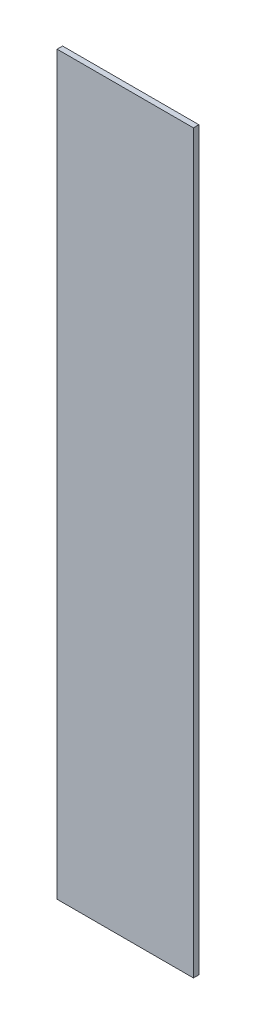
ISO-10303-21;
HEADER;
FILE_DESCRIPTION(('STEP AP214'),'2;1');
FILE_NAME('part.step','',(''),(''),'','','');
FILE_SCHEMA(('AUTOMOTIVE_DESIGN { 1 0 10303 214 1 1 1 1 }'));
ENDSEC;
DATA;
#1=APPLICATION_CONTEXT('core data for automotive mechanical design processes');
#2=APPLICATION_PROTOCOL_DEFINITION('international standard','automotive_design',2000,#1);
#3=PRODUCT_CONTEXT('',#1,'mechanical');
#4=PRODUCT('Part','Part','',(#3));
#5=PRODUCT_RELATED_PRODUCT_CATEGORY('part','',(#4));
#6=PRODUCT_DEFINITION_FORMATION('','',#4);
#7=PRODUCT_DEFINITION_CONTEXT('part definition',#1,'design');
#8=PRODUCT_DEFINITION('design','',#6,#7);
#9=PRODUCT_DEFINITION_SHAPE('','',#8);
#10=(LENGTH_UNIT() NAMED_UNIT(*) SI_UNIT(.MILLI.,.METRE.));
#11=(NAMED_UNIT(*) PLANE_ANGLE_UNIT() SI_UNIT($,.RADIAN.));
#12=(NAMED_UNIT(*) SI_UNIT($,.STERADIAN.) SOLID_ANGLE_UNIT());
#13=UNCERTAINTY_MEASURE_WITH_UNIT(LENGTH_MEASURE(1.E-05),#10,'distance_accuracy_value','');
#14=(GEOMETRIC_REPRESENTATION_CONTEXT(3) GLOBAL_UNCERTAINTY_ASSIGNED_CONTEXT((#13)) GLOBAL_UNIT_ASSIGNED_CONTEXT((#10,
#11,#12)) REPRESENTATION_CONTEXT('',''));
#15=CARTESIAN_POINT('',(0.,0.,0.));
#16=DIRECTION('',(0.,0.,1.));
#17=DIRECTION('',(1.,0.,0.));
#18=AXIS2_PLACEMENT_3D('',#15,#16,#17);
#19=CARTESIAN_POINT('',(0.,0.,10.));
#20=DIRECTION('',(1.,0.,0.));
#21=DIRECTION('',(0.,0.,-1.));
#22=AXIS2_PLACEMENT_3D('',#19,#20,#21);
#23=PLANE('',#22);
#24=DIRECTION('',(0.,-1.,0.));
#25=VECTOR('',#24,1.);
#26=CARTESIAN_POINT('',(0.,0.,0.));
#27=LINE('',#26,#25);
#28=CARTESIAN_POINT('',(0.,1350.,0.));
#29=VERTEX_POINT('',#28);
#30=CARTESIAN_POINT('',(0.,0.,0.));
#31=VERTEX_POINT('',#30);
#32=EDGE_CURVE('E98',#29,#31,#27,.T.);
#33=ORIENTED_EDGE('',*,*,#32,.T.);
#34=DIRECTION('',(0.,0.,-1.));
#35=VECTOR('',#34,1.);
#36=CARTESIAN_POINT('',(0.,0.,10.));
#37=LINE('',#36,#35);
#38=CARTESIAN_POINT('',(0.,0.,10.));
#39=VERTEX_POINT('',#38);
#40=EDGE_CURVE('E11',#39,#31,#37,.T.);
#41=ORIENTED_EDGE('',*,*,#40,.F.);
#42=DIRECTION('',(0.,-1.,0.));
#43=VECTOR('',#42,1.);
#44=CARTESIAN_POINT('',(0.,0.,10.));
#45=LINE('',#44,#43);
#46=CARTESIAN_POINT('',(0.,1350.,10.));
#47=VERTEX_POINT('',#46);
#48=EDGE_CURVE('E86',#47,#39,#45,.T.);
#49=ORIENTED_EDGE('',*,*,#48,.F.);
#50=DIRECTION('',(0.,0.,-1.));
#51=VECTOR('',#50,1.);
#52=CARTESIAN_POINT('',(0.,1350.,10.));
#53=LINE('',#52,#51);
#54=EDGE_CURVE('E94',#47,#29,#53,.T.);
#55=ORIENTED_EDGE('',*,*,#54,.T.);
#56=EDGE_LOOP('',(#33,#41,#49,#55));
#57=FACE_BOUND('',#56,.T.);
#58=ADVANCED_FACE('F35',(#57),#23,.F.);
#59=CARTESIAN_POINT('',(0.,0.,10.));
#60=DIRECTION('',(0.,1.,0.));
#61=DIRECTION('',(0.,0.,1.));
#62=AXIS2_PLACEMENT_3D('',#59,#60,#61);
#63=PLANE('',#62);
#64=DIRECTION('',(1.,0.,0.));
#65=VECTOR('',#64,1.);
#66=CARTESIAN_POINT('',(0.,0.,0.));
#67=LINE('',#66,#65);
#68=CARTESIAN_POINT('',(250.,0.,0.));
#69=VERTEX_POINT('',#68);
#70=EDGE_CURVE('E90',#31,#69,#67,.T.);
#71=ORIENTED_EDGE('',*,*,#70,.T.);
#72=DIRECTION('',(0.,0.,-1.));
#73=VECTOR('',#72,1.);
#74=CARTESIAN_POINT('',(250.,0.,10.));
#75=LINE('',#74,#73);
#76=CARTESIAN_POINT('',(250.,0.,10.));
#77=VERTEX_POINT('',#76);
#78=EDGE_CURVE('E43',#77,#69,#75,.T.);
#79=ORIENTED_EDGE('',*,*,#78,.F.);
#80=DIRECTION('',(1.,0.,0.));
#81=VECTOR('',#80,1.);
#82=CARTESIAN_POINT('',(0.,0.,10.));
#83=LINE('',#82,#81);
#84=EDGE_CURVE('E81',#39,#77,#83,.T.);
#85=ORIENTED_EDGE('',*,*,#84,.F.);
#86=ORIENTED_EDGE('',*,*,#40,.T.);
#87=EDGE_LOOP('',(#71,#79,#85,#86));
#88=FACE_BOUND('',#87,.T.);
#89=ADVANCED_FACE('F89',(#88),#63,.F.);
#90=CARTESIAN_POINT('',(250.,0.,10.));
#91=DIRECTION('',(-1.,0.,0.));
#92=DIRECTION('',(0.,0.,1.));
#93=AXIS2_PLACEMENT_3D('',#90,#91,#92);
#94=PLANE('',#93);
#95=DIRECTION('',(0.,1.,0.));
#96=VECTOR('',#95,1.);
#97=CARTESIAN_POINT('',(250.,0.,0.));
#98=LINE('',#97,#96);
#99=CARTESIAN_POINT('',(250.,1350.,0.));
#100=VERTEX_POINT('',#99);
#101=EDGE_CURVE('E68',#69,#100,#98,.T.);
#102=ORIENTED_EDGE('',*,*,#101,.T.);
#103=DIRECTION('',(0.,0.,-1.));
#104=VECTOR('',#103,1.);
#105=CARTESIAN_POINT('',(250.,1350.,10.));
#106=LINE('',#105,#104);
#107=CARTESIAN_POINT('',(250.,1350.,10.));
#108=VERTEX_POINT('',#107);
#109=EDGE_CURVE('E91',#108,#100,#106,.T.);
#110=ORIENTED_EDGE('',*,*,#109,.F.);
#111=DIRECTION('',(0.,1.,0.));
#112=VECTOR('',#111,1.);
#113=CARTESIAN_POINT('',(250.,0.,10.));
#114=LINE('',#113,#112);
#115=EDGE_CURVE('E84',#77,#108,#114,.T.);
#116=ORIENTED_EDGE('',*,*,#115,.F.);
#117=ORIENTED_EDGE('',*,*,#78,.T.);
#118=EDGE_LOOP('',(#102,#110,#116,#117));
#119=FACE_BOUND('',#118,.T.);
#120=ADVANCED_FACE('F92',(#119),#94,.F.);
#121=CARTESIAN_POINT('',(0.,1350.,10.));
#122=DIRECTION('',(0.,-1.,0.));
#123=DIRECTION('',(0.,0.,-1.));
#124=AXIS2_PLACEMENT_3D('',#121,#122,#123);
#125=PLANE('',#124);
#126=DIRECTION('',(-1.,0.,0.));
#127=VECTOR('',#126,1.);
#128=CARTESIAN_POINT('',(0.,1350.,0.));
#129=LINE('',#128,#127);
#130=EDGE_CURVE('E74',#100,#29,#129,.T.);
#131=ORIENTED_EDGE('',*,*,#130,.T.);
#132=ORIENTED_EDGE('',*,*,#54,.F.);
#133=DIRECTION('',(-1.,0.,0.));
#134=VECTOR('',#133,1.);
#135=CARTESIAN_POINT('',(0.,1350.,10.));
#136=LINE('',#135,#134);
#137=EDGE_CURVE('E51',#108,#47,#136,.T.);
#138=ORIENTED_EDGE('',*,*,#137,.F.);
#139=ORIENTED_EDGE('',*,*,#109,.T.);
#140=EDGE_LOOP('',(#131,#132,#138,#139));
#141=FACE_BOUND('',#140,.T.);
#142=ADVANCED_FACE('F105',(#141),#125,.F.);
#143=CARTESIAN_POINT('',(0.,0.,10.));
#144=DIRECTION('',(0.,0.,-1.));
#145=DIRECTION('',(-1.,0.,0.));
#146=AXIS2_PLACEMENT_3D('',#143,#144,#145);
#147=PLANE('',#146);
#148=ORIENTED_EDGE('',*,*,#48,.T.);
#149=ORIENTED_EDGE('',*,*,#84,.T.);
#150=ORIENTED_EDGE('',*,*,#115,.T.);
#151=ORIENTED_EDGE('',*,*,#137,.T.);
#152=EDGE_LOOP('',(#148,#149,#150,#151));
#153=FACE_BOUND('',#152,.T.);
#154=ADVANCED_FACE('F82',(#153),#147,.F.);
#155=CARTESIAN_POINT('',(0.,0.,0.));
#156=DIRECTION('',(0.,0.,-1.));
#157=DIRECTION('',(-1.,0.,0.));
#158=AXIS2_PLACEMENT_3D('',#155,#156,#157);
#159=PLANE('',#158);
#160=ORIENTED_EDGE('',*,*,#32,.F.);
#161=ORIENTED_EDGE('',*,*,#130,.F.);
#162=ORIENTED_EDGE('',*,*,#101,.F.);
#163=ORIENTED_EDGE('',*,*,#70,.F.);
#164=EDGE_LOOP('',(#160,#161,#162,#163));
#165=FACE_BOUND('',#164,.T.);
#166=ADVANCED_FACE('F108',(#165),#159,.T.);
#167=CLOSED_SHELL('',(#58,#89,#120,#142,#154,#166));
#168=MANIFOLD_SOLID_BREP('B2',#167);
#169=ADVANCED_BREP_SHAPE_REPRESENTATION('',(#18,#168),#14);
#170=SHAPE_DEFINITION_REPRESENTATION(#9,#169);
ENDSEC;
END-ISO-10303-21;
